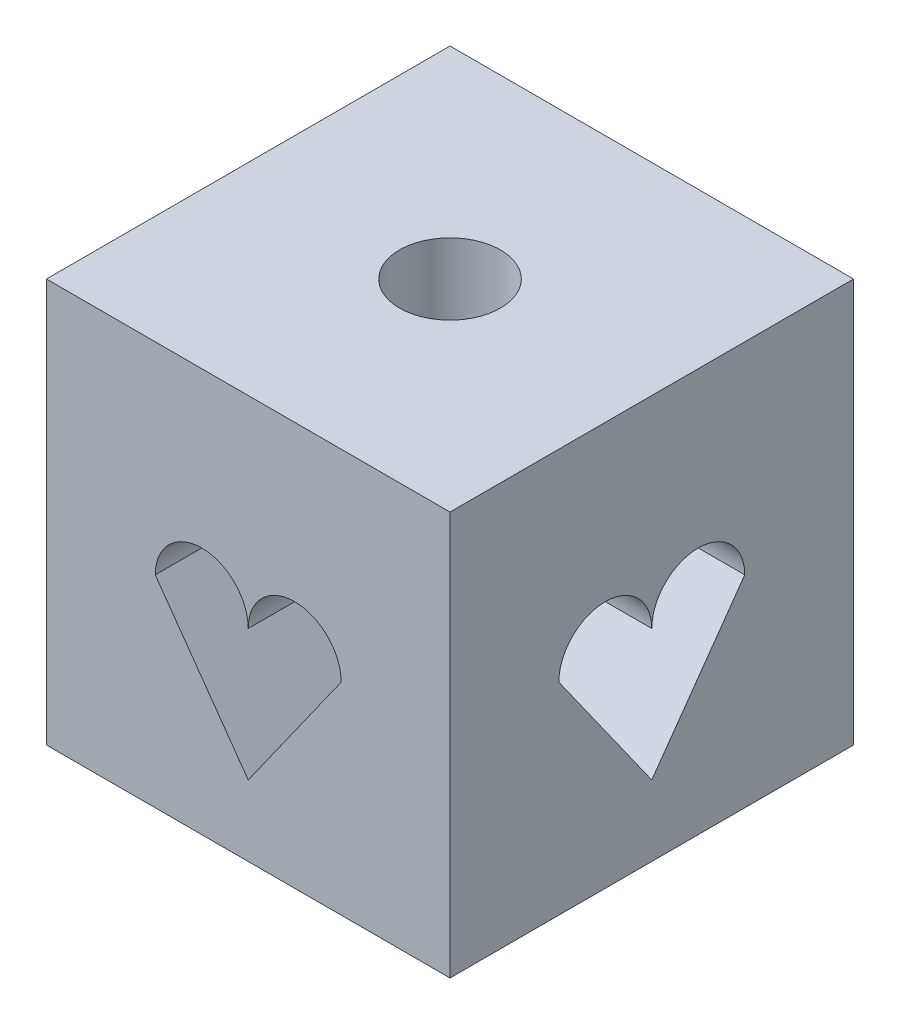
ISO-10303-21;
HEADER;
FILE_DESCRIPTION(('STEP AP214'),'2;1');
FILE_NAME('part.step','',(''),(''),'','','');
FILE_SCHEMA(('AUTOMOTIVE_DESIGN { 1 0 10303 214 1 1 1 1 }'));
ENDSEC;
DATA;
#1=APPLICATION_CONTEXT('core data for automotive mechanical design processes');
#2=APPLICATION_PROTOCOL_DEFINITION('international standard','automotive_design',2000,#1);
#3=PRODUCT_CONTEXT('',#1,'mechanical');
#4=PRODUCT('Part','Part','',(#3));
#5=PRODUCT_RELATED_PRODUCT_CATEGORY('part','',(#4));
#6=PRODUCT_DEFINITION_FORMATION('','',#4);
#7=PRODUCT_DEFINITION_CONTEXT('part definition',#1,'design');
#8=PRODUCT_DEFINITION('design','',#6,#7);
#9=PRODUCT_DEFINITION_SHAPE('','',#8);
#10=(LENGTH_UNIT() NAMED_UNIT(*) SI_UNIT(.MILLI.,.METRE.));
#11=(NAMED_UNIT(*) PLANE_ANGLE_UNIT() SI_UNIT($,.RADIAN.));
#12=(NAMED_UNIT(*) SI_UNIT($,.STERADIAN.) SOLID_ANGLE_UNIT());
#13=UNCERTAINTY_MEASURE_WITH_UNIT(LENGTH_MEASURE(1.E-05),#10,'distance_accuracy_value','');
#14=(GEOMETRIC_REPRESENTATION_CONTEXT(3) GLOBAL_UNCERTAINTY_ASSIGNED_CONTEXT((#13)) GLOBAL_UNIT_ASSIGNED_CONTEXT((#10,
#11,#12)) REPRESENTATION_CONTEXT('',''));
#15=CARTESIAN_POINT('',(0.,0.,0.));
#16=DIRECTION('',(0.,0.,1.));
#17=DIRECTION('',(1.,0.,0.));
#18=AXIS2_PLACEMENT_3D('',#15,#16,#17);
#19=CARTESIAN_POINT('',(0.,50.,-11.5166461212145));
#20=DIRECTION('',(-1.,0.,0.));
#21=DIRECTION('',(0.,0.,1.));
#22=AXIS2_PLACEMENT_3D('',#19,#20,#21);
#23=CYLINDRICAL_SURFACE('',#22,11.5166461212145);
#24=CARTESIAN_POINT('',(-11.5166461212145,50.,-11.5166461212145));
#25=DIRECTION('',(-0.707106781186549,0.,0.707106781186546));
#26=DIRECTION('',(-0.707106781186546,0.,-0.707106781186549));
#27=AXIS2_PLACEMENT_3D('',#24,#25,#26);
#28=ELLIPSE('',#27,16.286997137673,11.5166461212145);
#29=CARTESIAN_POINT('',(-23.0332922424289,50.,-23.033292242429));
#30=VERTEX_POINT('',#29);
#31=CARTESIAN_POINT('',(-11.5166461212145,61.5166461212145,-11.5166461212145));
#32=VERTEX_POINT('',#31);
#33=EDGE_CURVE('E349',#30,#32,#28,.F.);
#34=ORIENTED_EDGE('',*,*,#33,.T.);
#35=CARTESIAN_POINT('',(-11.5166461212145,50.,-11.5166461212145));
#36=DIRECTION('',(-0.707106781186546,0.,-0.707106781186549));
#37=DIRECTION('',(-0.707106781186549,0.,0.707106781186546));
#38=AXIS2_PLACEMENT_3D('',#35,#36,#37);
#39=ELLIPSE('',#38,16.2869971376731,11.5166461212145);
#40=CARTESIAN_POINT('',(-23.033292242429,50.,0.));
#41=VERTEX_POINT('',#40);
#42=EDGE_CURVE('E350',#32,#41,#39,.F.);
#43=ORIENTED_EDGE('',*,*,#42,.T.);
#44=DIRECTION('',(-1.,0.,0.));
#45=VECTOR('',#44,1.);
#46=CARTESIAN_POINT('',(0.,50.,0.));
#47=LINE('',#46,#45);
#48=CARTESIAN_POINT('',(-50.,50.,0.));
#49=VERTEX_POINT('',#48);
#50=EDGE_CURVE('E256',#41,#49,#47,.T.);
#51=ORIENTED_EDGE('',*,*,#50,.T.);
#52=CARTESIAN_POINT('',(-50.,50.,-11.5166461212145));
#53=DIRECTION('',(-1.,0.,0.));
#54=DIRECTION('',(0.,0.,-1.));
#55=AXIS2_PLACEMENT_3D('',#52,#53,#54);
#56=CIRCLE('',#55,11.5166461212145);
#57=CARTESIAN_POINT('',(-50.,50.,-23.033292242429));
#58=VERTEX_POINT('',#57);
#59=EDGE_CURVE('E366',#49,#58,#56,.T.);
#60=ORIENTED_EDGE('',*,*,#59,.T.);
#61=DIRECTION('',(-1.,0.,0.));
#62=VECTOR('',#61,1.);
#63=CARTESIAN_POINT('',(0.,50.,-23.033292242429));
#64=LINE('',#63,#62);
#65=EDGE_CURVE('E251',#30,#58,#64,.T.);
#66=ORIENTED_EDGE('',*,*,#65,.F.);
#67=EDGE_LOOP('',(#34,#43,#51,#60,#66));
#68=FACE_BOUND('',#67,.T.);
#69=ADVANCED_FACE('F37',(#68),#23,.F.);
#70=CARTESIAN_POINT('',(0.,50.,11.5166461212145));
#71=DIRECTION('',(-1.,0.,0.));
#72=DIRECTION('',(0.,0.,1.));
#73=AXIS2_PLACEMENT_3D('',#70,#71,#72);
#74=CYLINDRICAL_SURFACE('',#73,11.5166461212145);
#75=CARTESIAN_POINT('',(-11.5166461212145,50.,11.5166461212145));
#76=DIRECTION('',(-0.707106781186549,0.,0.707106781186546));
#77=DIRECTION('',(-0.707106781186546,0.,-0.707106781186549));
#78=AXIS2_PLACEMENT_3D('',#75,#76,#77);
#79=ELLIPSE('',#78,16.286997137673,11.5166461212145);
#80=CARTESIAN_POINT('',(-11.5166461212145,61.5166461212145,11.5166461212145));
#81=VERTEX_POINT('',#80);
#82=EDGE_CURVE('E234',#41,#81,#79,.F.);
#83=ORIENTED_EDGE('',*,*,#82,.T.);
#84=CARTESIAN_POINT('',(-11.5166461212145,50.,11.5166461212145));
#85=DIRECTION('',(-0.707106781186546,0.,-0.707106781186549));
#86=DIRECTION('',(-0.707106781186549,0.,0.707106781186546));
#87=AXIS2_PLACEMENT_3D('',#84,#85,#86);
#88=ELLIPSE('',#87,16.2869971376731,11.5166461212145);
#89=CARTESIAN_POINT('',(-23.0332922424291,50.,23.033292242429));
#90=VERTEX_POINT('',#89);
#91=EDGE_CURVE('E346',#81,#90,#88,.F.);
#92=ORIENTED_EDGE('',*,*,#91,.T.);
#93=DIRECTION('',(-1.,0.,0.));
#94=VECTOR('',#93,1.);
#95=CARTESIAN_POINT('',(0.,50.,23.033292242429));
#96=LINE('',#95,#94);
#97=CARTESIAN_POINT('',(-50.,50.,23.033292242429));
#98=VERTEX_POINT('',#97);
#99=EDGE_CURVE('E243',#90,#98,#96,.T.);
#100=ORIENTED_EDGE('',*,*,#99,.T.);
#101=CARTESIAN_POINT('',(-50.,50.,11.5166461212145));
#102=DIRECTION('',(-1.,0.,0.));
#103=DIRECTION('',(0.,0.,1.));
#104=AXIS2_PLACEMENT_3D('',#101,#102,#103);
#105=CIRCLE('',#104,11.5166461212145);
#106=EDGE_CURVE('E364',#98,#49,#105,.T.);
#107=ORIENTED_EDGE('',*,*,#106,.T.);
#108=ORIENTED_EDGE('',*,*,#50,.F.);
#109=EDGE_LOOP('',(#83,#92,#100,#107,#108));
#110=FACE_BOUND('',#109,.T.);
#111=ADVANCED_FACE('F312',(#110),#74,.F.);
#112=CARTESIAN_POINT('',(-50.,100.,-50.));
#113=DIRECTION('',(1.,0.,0.));
#114=DIRECTION('',(0.,0.,-1.));
#115=AXIS2_PLACEMENT_3D('',#112,#113,#114);
#116=PLANE('',#115);
#117=ORIENTED_EDGE('',*,*,#106,.F.);
#118=DIRECTION('',(0.,0.815912330981919,0.578175637805375));
#119=VECTOR('',#118,1.);
#120=CARTESIAN_POINT('',(-50.,17.4957816710463,0.));
#121=LINE('',#120,#119);
#122=CARTESIAN_POINT('',(-50.,17.4957816710463,0.));
#123=VERTEX_POINT('',#122);
#124=EDGE_CURVE('E244',#123,#98,#121,.T.);
#125=ORIENTED_EDGE('',*,*,#124,.F.);
#126=DIRECTION('',(0.,-0.815912330981919,0.578175637805375));
#127=VECTOR('',#126,1.);
#128=CARTESIAN_POINT('',(-50.,17.4957816710463,0.));
#129=LINE('',#128,#127);
#130=EDGE_CURVE('E248',#58,#123,#129,.T.);
#131=ORIENTED_EDGE('',*,*,#130,.F.);
#132=ORIENTED_EDGE('',*,*,#59,.F.);
#133=EDGE_LOOP('',(#117,#125,#131,#132));
#134=FACE_BOUND('',#133,.T.);
#135=DIRECTION('',(0.,0.,1.));
#136=VECTOR('',#135,1.);
#137=CARTESIAN_POINT('',(-50.,0.,-50.));
#138=LINE('',#137,#136);
#139=CARTESIAN_POINT('',(-50.,0.,-50.));
#140=VERTEX_POINT('',#139);
#141=CARTESIAN_POINT('',(-50.,0.,50.));
#142=VERTEX_POINT('',#141);
#143=EDGE_CURVE('E250',#140,#142,#138,.T.);
#144=ORIENTED_EDGE('',*,*,#143,.T.);
#145=DIRECTION('',(0.,-1.,0.));
#146=VECTOR('',#145,1.);
#147=CARTESIAN_POINT('',(-50.,100.,50.));
#148=LINE('',#147,#146);
#149=CARTESIAN_POINT('',(-50.,100.,50.));
#150=VERTEX_POINT('',#149);
#151=EDGE_CURVE('E11',#150,#142,#148,.T.);
#152=ORIENTED_EDGE('',*,*,#151,.F.);
#153=DIRECTION('',(0.,0.,1.));
#154=VECTOR('',#153,1.);
#155=CARTESIAN_POINT('',(-50.,100.,-50.));
#156=LINE('',#155,#154);
#157=CARTESIAN_POINT('',(-50.,100.,-50.));
#158=VERTEX_POINT('',#157);
#159=EDGE_CURVE('E263',#158,#150,#156,.T.);
#160=ORIENTED_EDGE('',*,*,#159,.F.);
#161=DIRECTION('',(0.,-1.,0.));
#162=VECTOR('',#161,1.);
#163=CARTESIAN_POINT('',(-50.,100.,-50.));
#164=LINE('',#163,#162);
#165=EDGE_CURVE('E272',#158,#140,#164,.T.);
#166=ORIENTED_EDGE('',*,*,#165,.T.);
#167=EDGE_LOOP('',(#144,#152,#160,#166));
#168=FACE_BOUND('',#167,.T.);
#169=ADVANCED_FACE('F39',(#134,#168),#116,.F.);
#170=CARTESIAN_POINT('',(50.,100.,50.));
#171=DIRECTION('',(0.,0.,-1.));
#172=DIRECTION('',(-1.,0.,0.));
#173=AXIS2_PLACEMENT_3D('',#170,#171,#172);
#174=PLANE('',#173);
#175=DIRECTION('',(0.578175637805375,0.815912330981919,0.));
#176=VECTOR('',#175,1.);
#177=CARTESIAN_POINT('',(-5.16783306922563E-13,17.4957816710463,50.));
#178=LINE('',#177,#176);
#179=CARTESIAN_POINT('',(-5.27355936696949E-13,17.4957816710463,50.));
#180=VERTEX_POINT('',#179);
#181=CARTESIAN_POINT('',(23.0332922424285,50.,50.0000000000002));
#182=VERTEX_POINT('',#181);
#183=EDGE_CURVE('E423',#180,#182,#178,.T.);
#184=ORIENTED_EDGE('',*,*,#183,.F.);
#185=DIRECTION('',(0.578175637805375,-0.815912330981919,0.));
#186=VECTOR('',#185,1.);
#187=CARTESIAN_POINT('',(-5.16783306922563E-13,17.4957816710463,50.));
#188=LINE('',#187,#186);
#189=CARTESIAN_POINT('',(-23.0332922424295,50.,49.9999999999998));
#190=VERTEX_POINT('',#189);
#191=EDGE_CURVE('E216',#190,#180,#188,.T.);
#192=ORIENTED_EDGE('',*,*,#191,.F.);
#193=CARTESIAN_POINT('',(-11.516646121215,50.,49.9999999999999));
#194=DIRECTION('',(0.,0.,1.));
#195=DIRECTION('',(-1.,0.,0.));
#196=AXIS2_PLACEMENT_3D('',#193,#194,#195);
#197=CIRCLE('',#196,11.5166461212145);
#198=CARTESIAN_POINT('',(-5.16783306922563E-13,50.,50.));
#199=VERTEX_POINT('',#198);
#200=EDGE_CURVE('E375',#199,#190,#197,.T.);
#201=ORIENTED_EDGE('',*,*,#200,.F.);
#202=CARTESIAN_POINT('',(11.516646121214,50.,50.0000000000001));
#203=DIRECTION('',(0.,0.,1.));
#204=DIRECTION('',(1.,0.,0.));
#205=AXIS2_PLACEMENT_3D('',#202,#203,#204);
#206=CIRCLE('',#205,11.5166461212145);
#207=EDGE_CURVE('E420',#182,#199,#206,.T.);
#208=ORIENTED_EDGE('',*,*,#207,.F.);
#209=EDGE_LOOP('',(#184,#192,#201,#208));
#210=FACE_BOUND('',#209,.T.);
#211=DIRECTION('',(1.,0.,0.));
#212=VECTOR('',#211,1.);
#213=CARTESIAN_POINT('',(50.,0.,50.));
#214=LINE('',#213,#212);
#215=CARTESIAN_POINT('',(50.,0.,50.));
#216=VERTEX_POINT('',#215);
#217=EDGE_CURVE('E254',#142,#216,#214,.T.);
#218=ORIENTED_EDGE('',*,*,#217,.T.);
#219=DIRECTION('',(0.,-1.,0.));
#220=VECTOR('',#219,1.);
#221=CARTESIAN_POINT('',(50.,100.,50.));
#222=LINE('',#221,#220);
#223=CARTESIAN_POINT('',(50.,100.,50.));
#224=VERTEX_POINT('',#223);
#225=EDGE_CURVE('E45',#224,#216,#222,.T.);
#226=ORIENTED_EDGE('',*,*,#225,.F.);
#227=DIRECTION('',(1.,0.,0.));
#228=VECTOR('',#227,1.);
#229=CARTESIAN_POINT('',(50.,100.,50.));
#230=LINE('',#229,#228);
#231=EDGE_CURVE('E266',#150,#224,#230,.T.);
#232=ORIENTED_EDGE('',*,*,#231,.F.);
#233=ORIENTED_EDGE('',*,*,#151,.T.);
#234=EDGE_LOOP('',(#218,#226,#232,#233));
#235=FACE_BOUND('',#234,.T.);
#236=ADVANCED_FACE('F303',(#210,#235),#174,.F.);
#237=CARTESIAN_POINT('',(50.,100.,-50.));
#238=DIRECTION('',(-1.,0.,0.));
#239=DIRECTION('',(0.,0.,1.));
#240=AXIS2_PLACEMENT_3D('',#237,#238,#239);
#241=PLANE('',#240);
#242=DIRECTION('',(0.,0.815912330981919,-0.578175637805375));
#243=VECTOR('',#242,1.);
#244=CARTESIAN_POINT('',(50.,17.4957816710463,0.));
#245=LINE('',#244,#243);
#246=CARTESIAN_POINT('',(50.,17.4957816710463,0.));
#247=VERTEX_POINT('',#246);
#248=CARTESIAN_POINT('',(50.,50.,-23.033292242429));
#249=VERTEX_POINT('',#248);
#250=EDGE_CURVE('E208',#247,#249,#245,.T.);
#251=ORIENTED_EDGE('',*,*,#250,.F.);
#252=DIRECTION('',(0.,-0.815912330981919,-0.578175637805375));
#253=VECTOR('',#252,1.);
#254=CARTESIAN_POINT('',(50.,17.4957816710463,0.));
#255=LINE('',#254,#253);
#256=CARTESIAN_POINT('',(50.,50.,23.033292242429));
#257=VERTEX_POINT('',#256);
#258=EDGE_CURVE('E193',#257,#247,#255,.T.);
#259=ORIENTED_EDGE('',*,*,#258,.F.);
#260=CARTESIAN_POINT('',(50.,50.,11.5166461212145));
#261=DIRECTION('',(1.,0.,0.));
#262=DIRECTION('',(0.,0.,1.));
#263=AXIS2_PLACEMENT_3D('',#260,#261,#262);
#264=CIRCLE('',#263,11.5166461212145);
#265=CARTESIAN_POINT('',(50.,50.,0.));
#266=VERTEX_POINT('',#265);
#267=EDGE_CURVE('E401',#266,#257,#264,.T.);
#268=ORIENTED_EDGE('',*,*,#267,.F.);
#269=CARTESIAN_POINT('',(50.,50.,-11.5166461212145));
#270=DIRECTION('',(1.,0.,0.));
#271=DIRECTION('',(0.,0.,-1.));
#272=AXIS2_PLACEMENT_3D('',#269,#270,#271);
#273=CIRCLE('',#272,11.5166461212145);
#274=EDGE_CURVE('E404',#249,#266,#273,.T.);
#275=ORIENTED_EDGE('',*,*,#274,.F.);
#276=EDGE_LOOP('',(#251,#259,#268,#275));
#277=FACE_BOUND('',#276,.T.);
#278=DIRECTION('',(0.,0.,-1.));
#279=VECTOR('',#278,1.);
#280=CARTESIAN_POINT('',(50.,0.,-50.));
#281=LINE('',#280,#279);
#282=CARTESIAN_POINT('',(50.,0.,-50.));
#283=VERTEX_POINT('',#282);
#284=EDGE_CURVE('E275',#216,#283,#281,.T.);
#285=ORIENTED_EDGE('',*,*,#284,.T.);
#286=DIRECTION('',(0.,-1.,0.));
#287=VECTOR('',#286,1.);
#288=CARTESIAN_POINT('',(50.,100.,-50.));
#289=LINE('',#288,#287);
#290=CARTESIAN_POINT('',(50.,100.,-50.));
#291=VERTEX_POINT('',#290);
#292=EDGE_CURVE('E280',#291,#283,#289,.T.);
#293=ORIENTED_EDGE('',*,*,#292,.F.);
#294=DIRECTION('',(0.,0.,-1.));
#295=VECTOR('',#294,1.);
#296=CARTESIAN_POINT('',(50.,100.,-50.));
#297=LINE('',#296,#295);
#298=EDGE_CURVE('E269',#224,#291,#297,.T.);
#299=ORIENTED_EDGE('',*,*,#298,.F.);
#300=ORIENTED_EDGE('',*,*,#225,.T.);
#301=EDGE_LOOP('',(#285,#293,#299,#300));
#302=FACE_BOUND('',#301,.T.);
#303=ADVANCED_FACE('F287',(#277,#302),#241,.F.);
#304=CARTESIAN_POINT('',(50.,100.,-50.));
#305=DIRECTION('',(0.,0.,1.));
#306=DIRECTION('',(1.,0.,0.));
#307=AXIS2_PLACEMENT_3D('',#304,#305,#306);
#308=PLANE('',#307);
#309=DIRECTION('',(-0.578175637805375,0.815912330981919,0.));
#310=VECTOR('',#309,1.);
#311=CARTESIAN_POINT('',(1.67635173038249E-13,17.4957816710463,-50.));
#312=LINE('',#311,#310);
#313=CARTESIAN_POINT('',(1.67635173038249E-13,17.4957816710463,-50.));
#314=VERTEX_POINT('',#313);
#315=CARTESIAN_POINT('',(-23.0332922424288,50.,-50.));
#316=VERTEX_POINT('',#315);
#317=EDGE_CURVE('E227',#314,#316,#312,.T.);
#318=ORIENTED_EDGE('',*,*,#317,.F.);
#319=DIRECTION('',(-0.578175637805375,-0.815912330981919,0.));
#320=VECTOR('',#319,1.);
#321=CARTESIAN_POINT('',(1.67635173038249E-13,17.4957816710463,-50.));
#322=LINE('',#321,#320);
#323=CARTESIAN_POINT('',(23.0332922424292,50.,-49.9999999999999));
#324=VERTEX_POINT('',#323);
#325=EDGE_CURVE('E232',#324,#314,#322,.T.);
#326=ORIENTED_EDGE('',*,*,#325,.F.);
#327=CARTESIAN_POINT('',(11.5166461212147,50.,-50.));
#328=DIRECTION('',(0.,0.,-1.));
#329=DIRECTION('',(1.,0.,0.));
#330=AXIS2_PLACEMENT_3D('',#327,#328,#329);
#331=CIRCLE('',#330,11.5166461212145);
#332=CARTESIAN_POINT('',(1.67635173038249E-13,50.,-50.));
#333=VERTEX_POINT('',#332);
#334=EDGE_CURVE('E383',#333,#324,#331,.T.);
#335=ORIENTED_EDGE('',*,*,#334,.F.);
#336=CARTESIAN_POINT('',(-11.5166461212143,50.,-50.));
#337=DIRECTION('',(0.,0.,-1.));
#338=DIRECTION('',(-1.,0.,0.));
#339=AXIS2_PLACEMENT_3D('',#336,#337,#338);
#340=CIRCLE('',#339,11.5166461212145);
#341=EDGE_CURVE('E386',#316,#333,#340,.T.);
#342=ORIENTED_EDGE('',*,*,#341,.F.);
#343=EDGE_LOOP('',(#318,#326,#335,#342));
#344=FACE_BOUND('',#343,.T.);
#345=DIRECTION('',(-1.,0.,0.));
#346=VECTOR('',#345,1.);
#347=CARTESIAN_POINT('',(50.,0.,-50.));
#348=LINE('',#347,#346);
#349=EDGE_CURVE('E267',#283,#140,#348,.T.);
#350=ORIENTED_EDGE('',*,*,#349,.T.);
#351=ORIENTED_EDGE('',*,*,#165,.F.);
#352=DIRECTION('',(-1.,0.,0.));
#353=VECTOR('',#352,1.);
#354=CARTESIAN_POINT('',(50.,100.,-50.));
#355=LINE('',#354,#353);
#356=EDGE_CURVE('E271',#291,#158,#355,.T.);
#357=ORIENTED_EDGE('',*,*,#356,.F.);
#358=ORIENTED_EDGE('',*,*,#292,.T.);
#359=EDGE_LOOP('',(#350,#351,#357,#358));
#360=FACE_BOUND('',#359,.T.);
#361=ADVANCED_FACE('F296',(#344,#360),#308,.F.);
#362=CARTESIAN_POINT('',(0.,100.,0.));
#363=DIRECTION('',(0.,-1.,0.));
#364=DIRECTION('',(0.,0.,-1.));
#365=AXIS2_PLACEMENT_3D('',#362,#363,#364);
#366=PLANE('',#365);
#367=CARTESIAN_POINT('',(0.,100.,0.));
#368=DIRECTION('',(0.,1.,0.));
#369=DIRECTION('',(0.,0.,1.));
#370=AXIS2_PLACEMENT_3D('',#367,#368,#369);
#371=CIRCLE('',#370,12.5);
#372=CARTESIAN_POINT('',(0.,100.,12.5));
#373=VERTEX_POINT('',#372);
#374=EDGE_CURVE('E426',#373,#373,#371,.T.);
#375=ORIENTED_EDGE('',*,*,#374,.F.);
#376=EDGE_LOOP('',(#375));
#377=FACE_BOUND('',#376,.T.);
#378=ORIENTED_EDGE('',*,*,#159,.T.);
#379=ORIENTED_EDGE('',*,*,#231,.T.);
#380=ORIENTED_EDGE('',*,*,#298,.T.);
#381=ORIENTED_EDGE('',*,*,#356,.T.);
#382=EDGE_LOOP('',(#378,#379,#380,#381));
#383=FACE_BOUND('',#382,.T.);
#384=ADVANCED_FACE('F302',(#377,#383),#366,.F.);
#385=CARTESIAN_POINT('',(0.,0.,0.));
#386=DIRECTION('',(0.,-1.,0.));
#387=DIRECTION('',(0.,0.,-1.));
#388=AXIS2_PLACEMENT_3D('',#385,#386,#387);
#389=PLANE('',#388);
#390=ORIENTED_EDGE('',*,*,#143,.F.);
#391=ORIENTED_EDGE('',*,*,#349,.F.);
#392=ORIENTED_EDGE('',*,*,#284,.F.);
#393=ORIENTED_EDGE('',*,*,#217,.F.);
#394=EDGE_LOOP('',(#390,#391,#392,#393));
#395=FACE_BOUND('',#394,.T.);
#396=ADVANCED_FACE('F293',(#395),#389,.T.);
#397=CARTESIAN_POINT('',(0.,17.4957816710463,0.));
#398=DIRECTION('',(0.,-0.578175637805375,0.815912330981919));
#399=DIRECTION('',(0.,-0.815912330981919,-0.578175637805375));
#400=AXIS2_PLACEMENT_3D('',#397,#398,#399);
#401=PLANE('',#400);
#402=ORIENTED_EDGE('',*,*,#99,.F.);
#403=DIRECTION('',(0.500535805280539,-0.706348225214961,-0.500535805280538));
#404=VECTOR('',#403,1.);
#405=CARTESIAN_POINT('',(0.,17.4957816710463,0.));
#406=LINE('',#405,#404);
#407=CARTESIAN_POINT('',(0.,17.4957816710463,0.));
#408=VERTEX_POINT('',#407);
#409=EDGE_CURVE('E181',#90,#408,#406,.T.);
#410=ORIENTED_EDGE('',*,*,#409,.T.);
#411=DIRECTION('',(-1.,0.,0.));
#412=VECTOR('',#411,1.);
#413=CARTESIAN_POINT('',(0.,17.4957816710463,0.));
#414=LINE('',#413,#412);
#415=EDGE_CURVE('E241',#408,#123,#414,.T.);
#416=ORIENTED_EDGE('',*,*,#415,.T.);
#417=ORIENTED_EDGE('',*,*,#124,.T.);
#418=EDGE_LOOP('',(#402,#410,#416,#417));
#419=FACE_BOUND('',#418,.T.);
#420=ADVANCED_FACE('F239',(#419),#401,.F.);
#421=CARTESIAN_POINT('',(0.,17.4957816710463,0.));
#422=DIRECTION('',(0.,-0.578175637805375,-0.815912330981919));
#423=DIRECTION('',(0.,0.815912330981919,-0.578175637805375));
#424=AXIS2_PLACEMENT_3D('',#421,#422,#423);
#425=PLANE('',#424);
#426=ORIENTED_EDGE('',*,*,#415,.F.);
#427=DIRECTION('',(-0.500535805280537,0.706348225214963,-0.500535805280538));
#428=VECTOR('',#427,1.);
#429=CARTESIAN_POINT('',(0.,17.4957816710463,0.));
#430=LINE('',#429,#428);
#431=EDGE_CURVE('E170',#408,#30,#430,.T.);
#432=ORIENTED_EDGE('',*,*,#431,.T.);
#433=ORIENTED_EDGE('',*,*,#65,.T.);
#434=ORIENTED_EDGE('',*,*,#130,.T.);
#435=EDGE_LOOP('',(#426,#432,#433,#434));
#436=FACE_BOUND('',#435,.T.);
#437=ADVANCED_FACE('F246',(#436),#425,.F.);
#438=CARTESIAN_POINT('',(11.5166461212145,50.,0.));
#439=DIRECTION('',(0.,0.,-1.));
#440=DIRECTION('',(-1.,0.,0.));
#441=AXIS2_PLACEMENT_3D('',#438,#439,#440);
#442=CYLINDRICAL_SURFACE('',#441,11.5166461212145);
#443=CARTESIAN_POINT('',(11.5166461212145,50.,-11.5166461212145));
#444=DIRECTION('',(0.707106781186549,0.,-0.707106781186546));
#445=DIRECTION('',(-0.707106781186546,0.,-0.707106781186549));
#446=AXIS2_PLACEMENT_3D('',#443,#444,#445);
#447=ELLIPSE('',#446,16.286997137673,11.5166461212145);
#448=CARTESIAN_POINT('',(11.5166461212145,61.5166461212145,-11.5166461212145));
#449=VERTEX_POINT('',#448);
#450=CARTESIAN_POINT('',(23.033292242429,50.,0.));
#451=VERTEX_POINT('',#450);
#452=EDGE_CURVE('E391',#449,#451,#447,.T.);
#453=ORIENTED_EDGE('',*,*,#452,.T.);
#454=CARTESIAN_POINT('',(11.5166461212144,50.,11.5166461212145));
#455=DIRECTION('',(0.707106781186544,0.,0.707106781186551));
#456=DIRECTION('',(0.707106781186551,0.,-0.707106781186544));
#457=AXIS2_PLACEMENT_3D('',#454,#455,#456);
#458=ELLIPSE('',#457,16.2869971376731,11.5166461212145);
#459=CARTESIAN_POINT('',(11.5166461212144,61.5166461212145,11.5166461212145));
#460=VERTEX_POINT('',#459);
#461=EDGE_CURVE('E209',#460,#451,#458,.F.);
#462=ORIENTED_EDGE('',*,*,#461,.F.);
#463=CARTESIAN_POINT('',(11.5166461212144,50.,11.5166461212145));
#464=DIRECTION('',(0.707106781186551,0.,-0.707106781186544));
#465=DIRECTION('',(0.707106781186544,0.,0.707106781186551));
#466=AXIS2_PLACEMENT_3D('',#463,#464,#465);
#467=ELLIPSE('',#466,16.286997137673,11.5166461212145);
#468=CARTESIAN_POINT('',(0.,50.,0.));
#469=VERTEX_POINT('',#468);
#470=EDGE_CURVE('E412',#469,#460,#467,.T.);
#471=ORIENTED_EDGE('',*,*,#470,.F.);
#472=CARTESIAN_POINT('',(11.5166461212145,50.,-11.5166461212145));
#473=DIRECTION('',(-0.707106781186546,0.,-0.707106781186549));
#474=DIRECTION('',(0.707106781186549,0.,-0.707106781186546));
#475=AXIS2_PLACEMENT_3D('',#472,#473,#474);
#476=ELLIPSE('',#475,16.2869971376731,11.5166461212145);
#477=EDGE_CURVE('E344',#469,#449,#476,.T.);
#478=ORIENTED_EDGE('',*,*,#477,.T.);
#479=EDGE_LOOP('',(#453,#462,#471,#478));
#480=FACE_BOUND('',#479,.T.);
#481=ADVANCED_FACE('F456',(#480),#442,.F.);
#482=CARTESIAN_POINT('',(0.,50.,-11.5166461212145));
#483=DIRECTION('',(1.,0.,0.));
#484=DIRECTION('',(0.,0.,-1.));
#485=AXIS2_PLACEMENT_3D('',#482,#483,#484);
#486=CYLINDRICAL_SURFACE('',#485,11.5166461212145);
#487=CARTESIAN_POINT('',(11.5166461212145,50.,-11.5166461212145));
#488=DIRECTION('',(-0.707106781186546,0.,-0.707106781186549));
#489=DIRECTION('',(0.707106781186549,0.,-0.707106781186546));
#490=AXIS2_PLACEMENT_3D('',#487,#488,#489);
#491=ELLIPSE('',#490,16.2869971376731,11.5166461212145);
#492=CARTESIAN_POINT('',(23.0332922424291,50.,-23.033292242429));
#493=VERTEX_POINT('',#492);
#494=EDGE_CURVE('E197',#493,#449,#491,.F.);
#495=ORIENTED_EDGE('',*,*,#494,.F.);
#496=DIRECTION('',(1.,0.,0.));
#497=VECTOR('',#496,1.);
#498=CARTESIAN_POINT('',(0.,50.,-23.033292242429));
#499=LINE('',#498,#497);
#500=EDGE_CURVE('E224',#493,#249,#499,.T.);
#501=ORIENTED_EDGE('',*,*,#500,.T.);
#502=ORIENTED_EDGE('',*,*,#274,.T.);
#503=DIRECTION('',(1.,0.,0.));
#504=VECTOR('',#503,1.);
#505=CARTESIAN_POINT('',(0.,50.,0.));
#506=LINE('',#505,#504);
#507=EDGE_CURVE('E397',#451,#266,#506,.T.);
#508=ORIENTED_EDGE('',*,*,#507,.F.);
#509=ORIENTED_EDGE('',*,*,#452,.F.);
#510=EDGE_LOOP('',(#495,#501,#502,#508,#509));
#511=FACE_BOUND('',#510,.T.);
#512=ADVANCED_FACE('F460',(#511),#486,.F.);
#513=CARTESIAN_POINT('',(0.,50.,11.5166461212145));
#514=DIRECTION('',(1.,0.,0.));
#515=DIRECTION('',(0.,0.,-1.));
#516=AXIS2_PLACEMENT_3D('',#513,#514,#515);
#517=CYLINDRICAL_SURFACE('',#516,11.5166461212145);
#518=ORIENTED_EDGE('',*,*,#461,.T.);
#519=ORIENTED_EDGE('',*,*,#507,.T.);
#520=ORIENTED_EDGE('',*,*,#267,.T.);
#521=DIRECTION('',(1.,0.,0.));
#522=VECTOR('',#521,1.);
#523=CARTESIAN_POINT('',(0.,50.,23.033292242429));
#524=LINE('',#523,#522);
#525=CARTESIAN_POINT('',(23.0332922424288,50.,23.033292242429));
#526=VERTEX_POINT('',#525);
#527=EDGE_CURVE('E198',#526,#257,#524,.T.);
#528=ORIENTED_EDGE('',*,*,#527,.F.);
#529=CARTESIAN_POINT('',(11.5166461212144,50.,11.5166461212145));
#530=DIRECTION('',(0.707106781186551,0.,-0.707106781186544));
#531=DIRECTION('',(0.707106781186544,0.,0.707106781186551));
#532=AXIS2_PLACEMENT_3D('',#529,#530,#531);
#533=ELLIPSE('',#532,16.286997137673,11.5166461212145);
#534=EDGE_CURVE('E217',#526,#460,#533,.F.);
#535=ORIENTED_EDGE('',*,*,#534,.T.);
#536=EDGE_LOOP('',(#518,#519,#520,#528,#535));
#537=FACE_BOUND('',#536,.T.);
#538=ADVANCED_FACE('F466',(#537),#517,.F.);
#539=CARTESIAN_POINT('',(0.,17.4957816710463,0.));
#540=DIRECTION('',(0.,-0.578175637805375,-0.815912330981919));
#541=DIRECTION('',(0.,0.815912330981919,-0.578175637805375));
#542=AXIS2_PLACEMENT_3D('',#539,#540,#541);
#543=PLANE('',#542);
#544=DIRECTION('',(1.,0.,0.));
#545=VECTOR('',#544,1.);
#546=CARTESIAN_POINT('',(0.,17.4957816710463,0.));
#547=LINE('',#546,#545);
#548=EDGE_CURVE('E187',#408,#247,#547,.T.);
#549=ORIENTED_EDGE('',*,*,#548,.T.);
#550=ORIENTED_EDGE('',*,*,#250,.T.);
#551=ORIENTED_EDGE('',*,*,#500,.F.);
#552=DIRECTION('',(0.500535805280539,0.706348225214961,-0.500535805280538));
#553=VECTOR('',#552,1.);
#554=CARTESIAN_POINT('',(0.,17.4957816710463,0.));
#555=LINE('',#554,#553);
#556=EDGE_CURVE('E221',#408,#493,#555,.T.);
#557=ORIENTED_EDGE('',*,*,#556,.F.);
#558=EDGE_LOOP('',(#549,#550,#551,#557));
#559=FACE_BOUND('',#558,.T.);
#560=ADVANCED_FACE('F222',(#559),#543,.F.);
#561=CARTESIAN_POINT('',(0.,17.4957816710463,0.));
#562=DIRECTION('',(0.,-0.578175637805375,0.815912330981919));
#563=DIRECTION('',(0.,-0.815912330981919,-0.578175637805375));
#564=AXIS2_PLACEMENT_3D('',#561,#562,#563);
#565=PLANE('',#564);
#566=DIRECTION('',(0.500535805280534,0.706348225214964,0.500535805280539));
#567=VECTOR('',#566,1.);
#568=CARTESIAN_POINT('',(0.,17.4957816710463,0.));
#569=LINE('',#568,#567);
#570=EDGE_CURVE('E190',#408,#526,#569,.T.);
#571=ORIENTED_EDGE('',*,*,#570,.T.);
#572=ORIENTED_EDGE('',*,*,#527,.T.);
#573=ORIENTED_EDGE('',*,*,#258,.T.);
#574=ORIENTED_EDGE('',*,*,#548,.F.);
#575=EDGE_LOOP('',(#571,#572,#573,#574));
#576=FACE_BOUND('',#575,.T.);
#577=ADVANCED_FACE('F189',(#576),#565,.F.);
#578=CARTESIAN_POINT('',(0.,17.4957816710463,0.));
#579=DIRECTION('',(0.815912330981919,-0.578175637805375,0.));
#580=DIRECTION('',(0.578175637805375,0.815912330981919,0.));
#581=AXIS2_PLACEMENT_3D('',#578,#579,#580);
#582=PLANE('',#581);
#583=DIRECTION('',(0.,0.,1.));
#584=VECTOR('',#583,1.);
#585=CARTESIAN_POINT('',(0.,17.4957816710463,0.));
#586=LINE('',#585,#584);
#587=EDGE_CURVE('E205',#408,#180,#586,.T.);
#588=ORIENTED_EDGE('',*,*,#587,.T.);
#589=ORIENTED_EDGE('',*,*,#183,.T.);
#590=DIRECTION('',(0.,0.,1.));
#591=VECTOR('',#590,1.);
#592=CARTESIAN_POINT('',(23.033292242429,50.,2.35922392732846E-13));
#593=LINE('',#592,#591);
#594=EDGE_CURVE('E207',#526,#182,#593,.T.);
#595=ORIENTED_EDGE('',*,*,#594,.F.);
#596=ORIENTED_EDGE('',*,*,#570,.F.);
#597=EDGE_LOOP('',(#588,#589,#595,#596));
#598=FACE_BOUND('',#597,.T.);
#599=ADVANCED_FACE('F203',(#598),#582,.F.);
#600=CARTESIAN_POINT('',(11.5166461212145,50.,1.11022302462516E-13));
#601=DIRECTION('',(0.,0.,1.));
#602=DIRECTION('',(1.,0.,0.));
#603=AXIS2_PLACEMENT_3D('',#600,#601,#602);
#604=CYLINDRICAL_SURFACE('',#603,11.5166461212145);
#605=ORIENTED_EDGE('',*,*,#534,.F.);
#606=ORIENTED_EDGE('',*,*,#594,.T.);
#607=ORIENTED_EDGE('',*,*,#207,.T.);
#608=DIRECTION('',(0.,0.,1.));
#609=VECTOR('',#608,1.);
#610=CARTESIAN_POINT('',(0.,50.,0.));
#611=LINE('',#610,#609);
#612=CARTESIAN_POINT('',(0.,50.,23.033292242429));
#613=VERTEX_POINT('',#612);
#614=EDGE_CURVE('E218',#613,#199,#611,.T.);
#615=ORIENTED_EDGE('',*,*,#614,.F.);
#616=CARTESIAN_POINT('',(11.5166461212144,50.,11.5166461212145));
#617=DIRECTION('',(0.707106781186544,0.,0.707106781186551));
#618=DIRECTION('',(0.707106781186551,0.,-0.707106781186544));
#619=AXIS2_PLACEMENT_3D('',#616,#617,#618);
#620=ELLIPSE('',#619,16.2869971376731,11.5166461212145);
#621=EDGE_CURVE('E410',#460,#613,#620,.T.);
#622=ORIENTED_EDGE('',*,*,#621,.F.);
#623=EDGE_LOOP('',(#605,#606,#607,#615,#622));
#624=FACE_BOUND('',#623,.T.);
#625=ADVANCED_FACE('F476',(#624),#604,.F.);
#626=CARTESIAN_POINT('',(0.,17.4957816710463,0.));
#627=DIRECTION('',(0.815912330981919,-0.578175637805375,0.));
#628=DIRECTION('',(0.578175637805375,0.815912330981919,0.));
#629=AXIS2_PLACEMENT_3D('',#626,#627,#628);
#630=PLANE('',#629);
#631=ORIENTED_EDGE('',*,*,#556,.T.);
#632=DIRECTION('',(0.,0.,-1.));
#633=VECTOR('',#632,1.);
#634=CARTESIAN_POINT('',(23.033292242429,50.,0.));
#635=LINE('',#634,#633);
#636=EDGE_CURVE('E235',#493,#324,#635,.T.);
#637=ORIENTED_EDGE('',*,*,#636,.T.);
#638=ORIENTED_EDGE('',*,*,#325,.T.);
#639=DIRECTION('',(0.,0.,-1.));
#640=VECTOR('',#639,1.);
#641=CARTESIAN_POINT('',(0.,17.4957816710463,0.));
#642=LINE('',#641,#640);
#643=EDGE_CURVE('E174',#408,#314,#642,.T.);
#644=ORIENTED_EDGE('',*,*,#643,.F.);
#645=EDGE_LOOP('',(#631,#637,#638,#644));
#646=FACE_BOUND('',#645,.T.);
#647=ADVANCED_FACE('F230',(#646),#630,.F.);
#648=CARTESIAN_POINT('',(11.5166461212145,50.,-11.5166461212145));
#649=DIRECTION('',(0.707106781186549,0.,-0.707106781186546));
#650=DIRECTION('',(-0.707106781186546,0.,-0.707106781186549));
#651=AXIS2_PLACEMENT_3D('',#648,#649,#650);
#652=ELLIPSE('',#651,16.286997137673,11.5166461212145);
#653=CARTESIAN_POINT('',(0.,50.,-23.033292242429));
#654=VERTEX_POINT('',#653);
#655=EDGE_CURVE('E228',#449,#654,#652,.F.);
#656=ORIENTED_EDGE('',*,*,#655,.T.);
#657=DIRECTION('',(0.,0.,-1.));
#658=VECTOR('',#657,1.);
#659=CARTESIAN_POINT('',(0.,50.,0.));
#660=LINE('',#659,#658);
#661=EDGE_CURVE('E376',#654,#333,#660,.T.);
#662=ORIENTED_EDGE('',*,*,#661,.T.);
#663=ORIENTED_EDGE('',*,*,#334,.T.);
#664=ORIENTED_EDGE('',*,*,#636,.F.);
#665=ORIENTED_EDGE('',*,*,#494,.T.);
#666=EDGE_LOOP('',(#656,#662,#663,#664,#665));
#667=FACE_BOUND('',#666,.T.);
#668=ADVANCED_FACE('F462',(#667),#442,.F.);
#669=CARTESIAN_POINT('',(-11.5166461212145,50.,0.));
#670=DIRECTION('',(0.,0.,-1.));
#671=DIRECTION('',(-1.,0.,0.));
#672=AXIS2_PLACEMENT_3D('',#669,#670,#671);
#673=CYLINDRICAL_SURFACE('',#672,11.5166461212145);
#674=CARTESIAN_POINT('',(-11.5166461212145,50.,11.5166461212145));
#675=DIRECTION('',(-0.707106781186549,0.,0.707106781186546));
#676=DIRECTION('',(-0.707106781186546,0.,-0.707106781186549));
#677=AXIS2_PLACEMENT_3D('',#674,#675,#676);
#678=ELLIPSE('',#677,16.286997137673,11.5166461212145);
#679=EDGE_CURVE('E52',#613,#81,#678,.T.);
#680=ORIENTED_EDGE('',*,*,#679,.F.);
#681=ORIENTED_EDGE('',*,*,#614,.T.);
#682=ORIENTED_EDGE('',*,*,#200,.T.);
#683=DIRECTION('',(0.,0.,-1.));
#684=VECTOR('',#683,1.);
#685=CARTESIAN_POINT('',(-23.033292242429,50.,0.));
#686=LINE('',#685,#684);
#687=EDGE_CURVE('E373',#190,#90,#686,.T.);
#688=ORIENTED_EDGE('',*,*,#687,.T.);
#689=ORIENTED_EDGE('',*,*,#91,.F.);
#690=EDGE_LOOP('',(#680,#681,#682,#688,#689));
#691=FACE_BOUND('',#690,.T.);
#692=ADVANCED_FACE('F338',(#691),#673,.F.);
#693=ORIENTED_EDGE('',*,*,#33,.F.);
#694=EDGE_CURVE('E177',#30,#316,#686,.T.);
#695=ORIENTED_EDGE('',*,*,#694,.T.);
#696=ORIENTED_EDGE('',*,*,#341,.T.);
#697=ORIENTED_EDGE('',*,*,#661,.F.);
#698=CARTESIAN_POINT('',(-11.5166461212145,50.,-11.5166461212145));
#699=DIRECTION('',(-0.707106781186546,0.,-0.707106781186549));
#700=DIRECTION('',(-0.707106781186549,0.,0.707106781186546));
#701=AXIS2_PLACEMENT_3D('',#698,#699,#700);
#702=ELLIPSE('',#701,16.2869971376731,11.5166461212145);
#703=EDGE_CURVE('E182',#32,#654,#702,.T.);
#704=ORIENTED_EDGE('',*,*,#703,.F.);
#705=EDGE_LOOP('',(#693,#695,#696,#697,#704));
#706=FACE_BOUND('',#705,.T.);
#707=ADVANCED_FACE('F339',(#706),#673,.F.);
#708=CARTESIAN_POINT('',(0.,17.4957816710463,0.));
#709=DIRECTION('',(-0.815912330981919,-0.578175637805375,0.));
#710=DIRECTION('',(0.578175637805375,-0.815912330981919,0.));
#711=AXIS2_PLACEMENT_3D('',#708,#709,#710);
#712=PLANE('',#711);
#713=ORIENTED_EDGE('',*,*,#643,.T.);
#714=ORIENTED_EDGE('',*,*,#317,.T.);
#715=ORIENTED_EDGE('',*,*,#694,.F.);
#716=ORIENTED_EDGE('',*,*,#431,.F.);
#717=EDGE_LOOP('',(#713,#714,#715,#716));
#718=FACE_BOUND('',#717,.T.);
#719=ADVANCED_FACE('F172',(#718),#712,.F.);
#720=ORIENTED_EDGE('',*,*,#687,.F.);
#721=ORIENTED_EDGE('',*,*,#191,.T.);
#722=ORIENTED_EDGE('',*,*,#587,.F.);
#723=ORIENTED_EDGE('',*,*,#409,.F.);
#724=EDGE_LOOP('',(#720,#721,#722,#723));
#725=FACE_BOUND('',#724,.T.);
#726=ADVANCED_FACE('F212',(#725),#712,.F.);
#727=ORIENTED_EDGE('',*,*,#679,.T.);
#728=CARTESIAN_POINT('',(-11.5166461212145,50.,11.5166461212145));
#729=DIRECTION('',(-0.707106781186546,0.,-0.707106781186549));
#730=DIRECTION('',(-0.707106781186549,0.,0.707106781186546));
#731=AXIS2_PLACEMENT_3D('',#728,#729,#730);
#732=ELLIPSE('',#731,16.2869971376731,11.5166461212145);
#733=EDGE_CURVE('E354',#81,#469,#732,.T.);
#734=ORIENTED_EDGE('',*,*,#733,.T.);
#735=ORIENTED_EDGE('',*,*,#470,.T.);
#736=ORIENTED_EDGE('',*,*,#621,.T.);
#737=EDGE_LOOP('',(#727,#734,#735,#736));
#738=FACE_BOUND('',#737,.T.);
#739=ADVANCED_FACE('F323',(#738),#74,.F.);
#740=ORIENTED_EDGE('',*,*,#733,.F.);
#741=ORIENTED_EDGE('',*,*,#82,.F.);
#742=ORIENTED_EDGE('',*,*,#42,.F.);
#743=CARTESIAN_POINT('',(-11.5166461212145,50.,-11.5166461212145));
#744=DIRECTION('',(-0.707106781186549,0.,0.707106781186546));
#745=DIRECTION('',(-0.707106781186546,0.,-0.707106781186549));
#746=AXIS2_PLACEMENT_3D('',#743,#744,#745);
#747=ELLIPSE('',#746,16.286997137673,11.5166461212145);
#748=EDGE_CURVE('E59',#469,#32,#747,.T.);
#749=ORIENTED_EDGE('',*,*,#748,.F.);
#750=EDGE_LOOP('',(#740,#741,#742,#749));
#751=FACE_BOUND('',#750,.T.);
#752=ADVANCED_FACE('F328',(#751),#673,.F.);
#753=ORIENTED_EDGE('',*,*,#748,.T.);
#754=ORIENTED_EDGE('',*,*,#703,.T.);
#755=ORIENTED_EDGE('',*,*,#655,.F.);
#756=ORIENTED_EDGE('',*,*,#477,.F.);
#757=EDGE_LOOP('',(#753,#754,#755,#756));
#758=FACE_BOUND('',#757,.T.);
#759=ADVANCED_FACE('F317',(#758),#23,.F.);
#760=CARTESIAN_POINT('',(0.,78.,0.));
#761=DIRECTION('',(0.,1.,0.));
#762=DIRECTION('',(0.,0.,1.));
#763=AXIS2_PLACEMENT_3D('',#760,#761,#762);
#764=CYLINDRICAL_SURFACE('',#763,12.5);
#765=CARTESIAN_POINT('',(0.,78.,0.));
#766=DIRECTION('',(0.,1.,0.));
#767=DIRECTION('',(0.,0.,1.));
#768=AXIS2_PLACEMENT_3D('',#765,#766,#767);
#769=CIRCLE('',#768,12.5);
#770=CARTESIAN_POINT('',(0.,78.,12.5));
#771=VERTEX_POINT('',#770);
#772=EDGE_CURVE('E425',#771,#771,#769,.T.);
#773=ORIENTED_EDGE('',*,*,#772,.F.);
#774=EDGE_LOOP('',(#773));
#775=FACE_BOUND('',#774,.T.);
#776=ORIENTED_EDGE('',*,*,#374,.T.);
#777=EDGE_LOOP('',(#776));
#778=FACE_BOUND('',#777,.T.);
#779=ADVANCED_FACE('F327',(#775,#778),#764,.F.);
#780=CARTESIAN_POINT('',(0.,78.,0.));
#781=DIRECTION('',(0.,1.,0.));
#782=DIRECTION('',(0.,0.,1.));
#783=AXIS2_PLACEMENT_3D('',#780,#781,#782);
#784=PLANE('',#783);
#785=ORIENTED_EDGE('',*,*,#772,.T.);
#786=EDGE_LOOP('',(#785));
#787=FACE_BOUND('',#786,.T.);
#788=ADVANCED_FACE('F334',(#787),#784,.T.);
#789=CLOSED_SHELL('',(#69,#111,#169,#236,#303,#361,#384,#396,#420,#437,#481,#512,#538,#560,#577,
#599,#625,#647,#668,#692,#707,#719,#726,#739,#752,#759,#779,#788));
#790=MANIFOLD_SOLID_BREP('B2',#789);
#791=ADVANCED_BREP_SHAPE_REPRESENTATION('',(#18,#790),#14);
#792=SHAPE_DEFINITION_REPRESENTATION(#9,#791);
ENDSEC;
END-ISO-10303-21;
